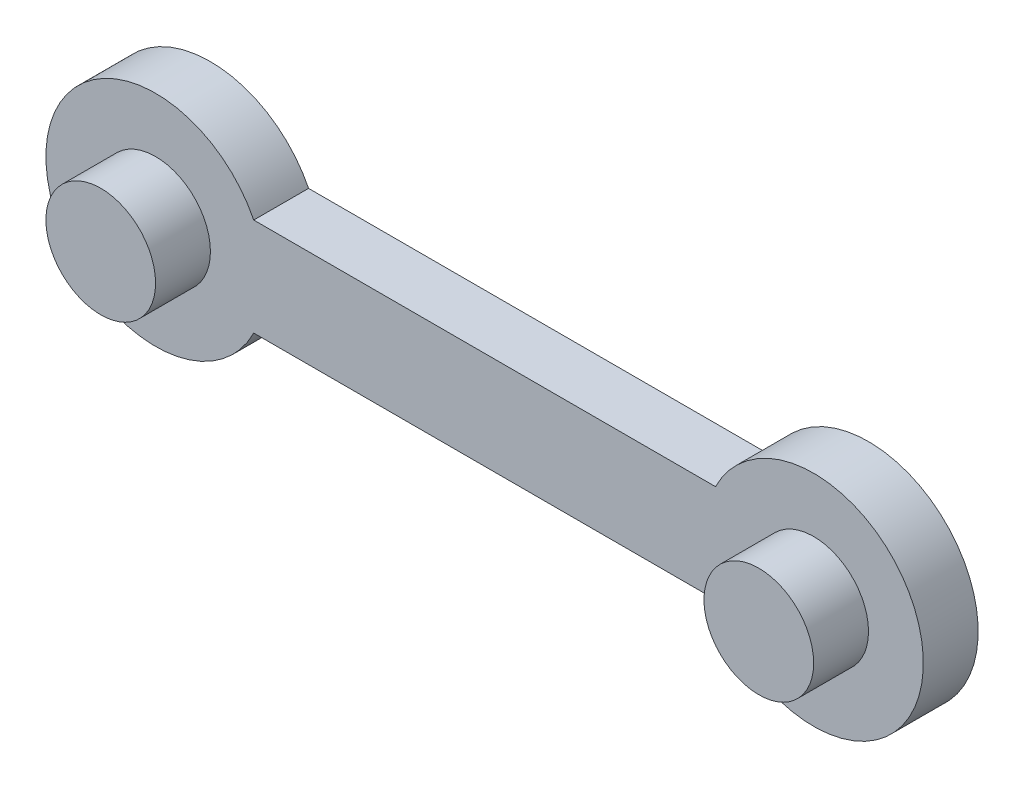
ISO-10303-21;
HEADER;
FILE_DESCRIPTION(('STEP AP214'),'2;1');
FILE_NAME('part.step','',(''),(''),'','','');
FILE_SCHEMA(('AUTOMOTIVE_DESIGN { 1 0 10303 214 1 1 1 1 }'));
ENDSEC;
DATA;
#1=APPLICATION_CONTEXT('core data for automotive mechanical design processes');
#2=APPLICATION_PROTOCOL_DEFINITION('international standard','automotive_design',2000,#1);
#3=PRODUCT_CONTEXT('',#1,'mechanical');
#4=PRODUCT('Part','Part','',(#3));
#5=PRODUCT_RELATED_PRODUCT_CATEGORY('part','',(#4));
#6=PRODUCT_DEFINITION_FORMATION('','',#4);
#7=PRODUCT_DEFINITION_CONTEXT('part definition',#1,'design');
#8=PRODUCT_DEFINITION('design','',#6,#7);
#9=PRODUCT_DEFINITION_SHAPE('','',#8);
#10=(LENGTH_UNIT() NAMED_UNIT(*) SI_UNIT(.MILLI.,.METRE.));
#11=(NAMED_UNIT(*) PLANE_ANGLE_UNIT() SI_UNIT($,.RADIAN.));
#12=(NAMED_UNIT(*) SI_UNIT($,.STERADIAN.) SOLID_ANGLE_UNIT());
#13=UNCERTAINTY_MEASURE_WITH_UNIT(LENGTH_MEASURE(1.E-05),#10,'distance_accuracy_value','');
#14=(GEOMETRIC_REPRESENTATION_CONTEXT(3) GLOBAL_UNCERTAINTY_ASSIGNED_CONTEXT((#13)) GLOBAL_UNIT_ASSIGNED_CONTEXT((#10,
#11,#12)) REPRESENTATION_CONTEXT('',''));
#15=CARTESIAN_POINT('',(0.,0.,0.));
#16=DIRECTION('',(0.,0.,1.));
#17=DIRECTION('',(1.,0.,0.));
#18=AXIS2_PLACEMENT_3D('',#15,#16,#17);
#19=CARTESIAN_POINT('',(0.,0.,5.));
#20=DIRECTION('',(0.,0.,-1.));
#21=DIRECTION('',(-1.,0.,0.));
#22=AXIS2_PLACEMENT_3D('',#19,#20,#21);
#23=CYLINDRICAL_SURFACE('',#22,10.);
#24=CARTESIAN_POINT('',(0.,0.,0.));
#25=DIRECTION('',(0.,0.,1.));
#26=DIRECTION('',(1.,0.,0.));
#27=AXIS2_PLACEMENT_3D('',#24,#25,#26);
#28=CIRCLE('',#27,10.);
#29=CARTESIAN_POINT('',(8.95006726528285,4.4605264203805,0.));
#30=VERTEX_POINT('',#29);
#31=CARTESIAN_POINT('',(8.95006726528285,-4.4605264203805,0.));
#32=VERTEX_POINT('',#31);
#33=EDGE_CURVE('E106',#30,#32,#28,.T.);
#34=ORIENTED_EDGE('',*,*,#33,.T.);
#35=DIRECTION('',(0.,0.,-1.));
#36=VECTOR('',#35,1.);
#37=CARTESIAN_POINT('',(8.95006726528285,-4.4605264203805,5.));
#38=LINE('',#37,#36);
#39=CARTESIAN_POINT('',(8.95006726528285,-4.4605264203805,5.));
#40=VERTEX_POINT('',#39);
#41=EDGE_CURVE('E11',#40,#32,#38,.T.);
#42=ORIENTED_EDGE('',*,*,#41,.F.);
#43=CARTESIAN_POINT('',(0.,0.,5.));
#44=DIRECTION('',(0.,0.,1.));
#45=DIRECTION('',(1.,0.,0.));
#46=AXIS2_PLACEMENT_3D('',#43,#44,#45);
#47=CIRCLE('',#46,10.);
#48=CARTESIAN_POINT('',(8.95006726528285,4.4605264203805,5.));
#49=VERTEX_POINT('',#48);
#50=EDGE_CURVE('E92',#49,#40,#47,.T.);
#51=ORIENTED_EDGE('',*,*,#50,.F.);
#52=DIRECTION('',(0.,0.,-1.));
#53=VECTOR('',#52,1.);
#54=CARTESIAN_POINT('',(8.95006726528285,4.4605264203805,5.));
#55=LINE('',#54,#53);
#56=EDGE_CURVE('E59',#49,#30,#55,.T.);
#57=ORIENTED_EDGE('',*,*,#56,.T.);
#58=EDGE_LOOP('',(#34,#42,#51,#57));
#59=FACE_BOUND('',#58,.T.);
#60=ADVANCED_FACE('F43',(#59),#23,.T.);
#61=CARTESIAN_POINT('',(0.,-4.4605264203805,5.));
#62=DIRECTION('',(0.,1.,0.));
#63=DIRECTION('',(-1.,0.,0.));
#64=AXIS2_PLACEMENT_3D('',#61,#62,#63);
#65=PLANE('',#64);
#66=DIRECTION('',(1.,0.,0.));
#67=VECTOR('',#66,1.);
#68=CARTESIAN_POINT('',(0.,-4.4605264203805,0.));
#69=LINE('',#68,#67);
#70=CARTESIAN_POINT('',(51.0499327347172,-4.4605264203805,0.));
#71=VERTEX_POINT('',#70);
#72=EDGE_CURVE('E97',#32,#71,#69,.T.);
#73=ORIENTED_EDGE('',*,*,#72,.T.);
#74=DIRECTION('',(0.,0.,-1.));
#75=VECTOR('',#74,1.);
#76=CARTESIAN_POINT('',(51.0499327347172,-4.4605264203805,5.));
#77=LINE('',#76,#75);
#78=CARTESIAN_POINT('',(51.0499327347172,-4.4605264203805,5.));
#79=VERTEX_POINT('',#78);
#80=EDGE_CURVE('E51',#79,#71,#77,.T.);
#81=ORIENTED_EDGE('',*,*,#80,.F.);
#82=DIRECTION('',(1.,0.,0.));
#83=VECTOR('',#82,1.);
#84=CARTESIAN_POINT('',(0.,-4.4605264203805,5.));
#85=LINE('',#84,#83);
#86=EDGE_CURVE('E85',#40,#79,#85,.T.);
#87=ORIENTED_EDGE('',*,*,#86,.F.);
#88=ORIENTED_EDGE('',*,*,#41,.T.);
#89=EDGE_LOOP('',(#73,#81,#87,#88));
#90=FACE_BOUND('',#89,.T.);
#91=ADVANCED_FACE('F96',(#90),#65,.F.);
#92=CARTESIAN_POINT('',(60.,0.,5.));
#93=DIRECTION('',(0.,0.,-1.));
#94=DIRECTION('',(-1.,0.,0.));
#95=AXIS2_PLACEMENT_3D('',#92,#93,#94);
#96=CYLINDRICAL_SURFACE('',#95,9.99999999999999);
#97=CARTESIAN_POINT('',(60.,0.,0.));
#98=DIRECTION('',(0.,0.,1.));
#99=DIRECTION('',(1.,0.,0.));
#100=AXIS2_PLACEMENT_3D('',#97,#98,#99);
#101=CIRCLE('',#100,9.99999999999999);
#102=CARTESIAN_POINT('',(51.0499327347172,4.4605264203805,0.));
#103=VERTEX_POINT('',#102);
#104=EDGE_CURVE('E110',#71,#103,#101,.T.);
#105=ORIENTED_EDGE('',*,*,#104,.T.);
#106=DIRECTION('',(0.,0.,-1.));
#107=VECTOR('',#106,1.);
#108=CARTESIAN_POINT('',(51.0499327347172,4.4605264203805,5.));
#109=LINE('',#108,#107);
#110=CARTESIAN_POINT('',(51.0499327347172,4.4605264203805,5.));
#111=VERTEX_POINT('',#110);
#112=EDGE_CURVE('E74',#111,#103,#109,.T.);
#113=ORIENTED_EDGE('',*,*,#112,.F.);
#114=CARTESIAN_POINT('',(60.,0.,5.));
#115=DIRECTION('',(0.,0.,1.));
#116=DIRECTION('',(1.,0.,0.));
#117=AXIS2_PLACEMENT_3D('',#114,#115,#116);
#118=CIRCLE('',#117,9.99999999999999);
#119=EDGE_CURVE('E91',#79,#111,#118,.T.);
#120=ORIENTED_EDGE('',*,*,#119,.F.);
#121=ORIENTED_EDGE('',*,*,#80,.T.);
#122=EDGE_LOOP('',(#105,#113,#120,#121));
#123=FACE_BOUND('',#122,.T.);
#124=ADVANCED_FACE('F100',(#123),#96,.T.);
#125=CARTESIAN_POINT('',(0.,4.4605264203805,5.));
#126=DIRECTION('',(0.,1.,0.));
#127=DIRECTION('',(-1.,0.,0.));
#128=AXIS2_PLACEMENT_3D('',#125,#126,#127);
#129=PLANE('',#128);
#130=DIRECTION('',(1.,0.,0.));
#131=VECTOR('',#130,1.);
#132=CARTESIAN_POINT('',(0.,4.4605264203805,0.));
#133=LINE('',#132,#131);
#134=EDGE_CURVE('E112',#30,#103,#133,.T.);
#135=ORIENTED_EDGE('',*,*,#134,.F.);
#136=ORIENTED_EDGE('',*,*,#56,.F.);
#137=DIRECTION('',(1.,0.,0.));
#138=VECTOR('',#137,1.);
#139=CARTESIAN_POINT('',(0.,4.4605264203805,5.));
#140=LINE('',#139,#138);
#141=EDGE_CURVE('E101',#49,#111,#140,.T.);
#142=ORIENTED_EDGE('',*,*,#141,.T.);
#143=ORIENTED_EDGE('',*,*,#112,.T.);
#144=EDGE_LOOP('',(#135,#136,#142,#143));
#145=FACE_BOUND('',#144,.T.);
#146=ADVANCED_FACE('F142',(#145),#129,.T.);
#147=CARTESIAN_POINT('',(0.,0.,5.));
#148=DIRECTION('',(0.,0.,1.));
#149=DIRECTION('',(1.,0.,0.));
#150=AXIS2_PLACEMENT_3D('',#147,#148,#149);
#151=PLANE('',#150);
#152=CARTESIAN_POINT('',(0.,0.,5.));
#153=DIRECTION('',(0.,0.,1.));
#154=DIRECTION('',(1.,0.,0.));
#155=AXIS2_PLACEMENT_3D('',#152,#153,#154);
#156=CIRCLE('',#155,5.);
#157=CARTESIAN_POINT('',(5.,0.,5.));
#158=VERTEX_POINT('',#157);
#159=EDGE_CURVE('E124',#158,#158,#156,.T.);
#160=ORIENTED_EDGE('',*,*,#159,.F.);
#161=EDGE_LOOP('',(#160));
#162=FACE_BOUND('',#161,.T.);
#163=CARTESIAN_POINT('',(60.,0.,5.));
#164=DIRECTION('',(0.,0.,1.));
#165=DIRECTION('',(1.,0.,0.));
#166=AXIS2_PLACEMENT_3D('',#163,#164,#165);
#167=CIRCLE('',#166,5.);
#168=CARTESIAN_POINT('',(65.,0.,5.));
#169=VERTEX_POINT('',#168);
#170=EDGE_CURVE('E118',#169,#169,#167,.T.);
#171=ORIENTED_EDGE('',*,*,#170,.F.);
#172=EDGE_LOOP('',(#171));
#173=FACE_BOUND('',#172,.T.);
#174=ORIENTED_EDGE('',*,*,#50,.T.);
#175=ORIENTED_EDGE('',*,*,#86,.T.);
#176=ORIENTED_EDGE('',*,*,#119,.T.);
#177=ORIENTED_EDGE('',*,*,#141,.F.);
#178=EDGE_LOOP('',(#174,#175,#176,#177));
#179=FACE_BOUND('',#178,.T.);
#180=ADVANCED_FACE('F88',(#162,#173,#179),#151,.T.);
#181=CARTESIAN_POINT('',(0.,0.,0.));
#182=DIRECTION('',(0.,0.,1.));
#183=DIRECTION('',(1.,0.,0.));
#184=AXIS2_PLACEMENT_3D('',#181,#182,#183);
#185=PLANE('',#184);
#186=ORIENTED_EDGE('',*,*,#33,.F.);
#187=ORIENTED_EDGE('',*,*,#134,.T.);
#188=ORIENTED_EDGE('',*,*,#104,.F.);
#189=ORIENTED_EDGE('',*,*,#72,.F.);
#190=EDGE_LOOP('',(#186,#187,#188,#189));
#191=FACE_BOUND('',#190,.T.);
#192=ADVANCED_FACE('F141',(#191),#185,.F.);
#193=CARTESIAN_POINT('',(60.,0.,10.));
#194=DIRECTION('',(0.,0.,-1.));
#195=DIRECTION('',(-1.,0.,0.));
#196=AXIS2_PLACEMENT_3D('',#193,#194,#195);
#197=CYLINDRICAL_SURFACE('',#196,5.);
#198=CARTESIAN_POINT('',(60.,0.,10.));
#199=DIRECTION('',(0.,0.,1.));
#200=DIRECTION('',(1.,0.,0.));
#201=AXIS2_PLACEMENT_3D('',#198,#199,#200);
#202=CIRCLE('',#201,5.);
#203=CARTESIAN_POINT('',(65.,0.,10.));
#204=VERTEX_POINT('',#203);
#205=EDGE_CURVE('E108',#204,#204,#202,.T.);
#206=ORIENTED_EDGE('',*,*,#205,.F.);
#207=EDGE_LOOP('',(#206));
#208=FACE_BOUND('',#207,.T.);
#209=ORIENTED_EDGE('',*,*,#170,.T.);
#210=EDGE_LOOP('',(#209));
#211=FACE_BOUND('',#210,.T.);
#212=ADVANCED_FACE('F146',(#208,#211),#197,.T.);
#213=CARTESIAN_POINT('',(60.,0.,10.));
#214=DIRECTION('',(0.,0.,1.));
#215=DIRECTION('',(1.,0.,0.));
#216=AXIS2_PLACEMENT_3D('',#213,#214,#215);
#217=PLANE('',#216);
#218=ORIENTED_EDGE('',*,*,#205,.T.);
#219=EDGE_LOOP('',(#218));
#220=FACE_BOUND('',#219,.T.);
#221=ADVANCED_FACE('F135',(#220),#217,.T.);
#222=CARTESIAN_POINT('',(0.,0.,10.));
#223=DIRECTION('',(0.,0.,-1.));
#224=DIRECTION('',(-1.,0.,0.));
#225=AXIS2_PLACEMENT_3D('',#222,#223,#224);
#226=CYLINDRICAL_SURFACE('',#225,5.);
#227=CARTESIAN_POINT('',(0.,0.,10.));
#228=DIRECTION('',(0.,0.,1.));
#229=DIRECTION('',(1.,0.,0.));
#230=AXIS2_PLACEMENT_3D('',#227,#228,#229);
#231=CIRCLE('',#230,5.);
#232=CARTESIAN_POINT('',(5.,0.,10.));
#233=VERTEX_POINT('',#232);
#234=EDGE_CURVE('E121',#233,#233,#231,.T.);
#235=ORIENTED_EDGE('',*,*,#234,.F.);
#236=EDGE_LOOP('',(#235));
#237=FACE_BOUND('',#236,.T.);
#238=ORIENTED_EDGE('',*,*,#159,.T.);
#239=EDGE_LOOP('',(#238));
#240=FACE_BOUND('',#239,.T.);
#241=ADVANCED_FACE('F132',(#237,#240),#226,.T.);
#242=CARTESIAN_POINT('',(0.,0.,10.));
#243=DIRECTION('',(0.,0.,1.));
#244=DIRECTION('',(1.,0.,0.));
#245=AXIS2_PLACEMENT_3D('',#242,#243,#244);
#246=PLANE('',#245);
#247=ORIENTED_EDGE('',*,*,#234,.T.);
#248=EDGE_LOOP('',(#247));
#249=FACE_BOUND('',#248,.T.);
#250=ADVANCED_FACE('F130',(#249),#246,.T.);
#251=CLOSED_SHELL('',(#60,#91,#124,#146,#180,#192,#212,#221,#241,#250));
#252=MANIFOLD_SOLID_BREP('B2',#251);
#253=ADVANCED_BREP_SHAPE_REPRESENTATION('',(#18,#252),#14);
#254=SHAPE_DEFINITION_REPRESENTATION(#9,#253);
ENDSEC;
END-ISO-10303-21;
